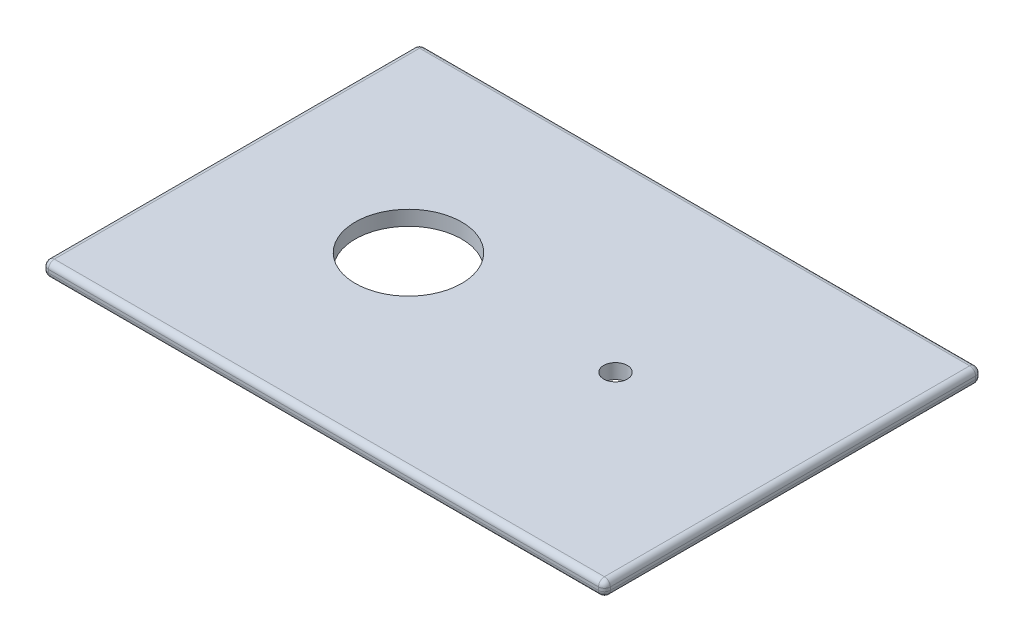
ISO-10303-21;
HEADER;
FILE_DESCRIPTION(('STEP AP214'),'2;1');
FILE_NAME('part.step','',(''),(''),'','','');
FILE_SCHEMA(('AUTOMOTIVE_DESIGN { 1 0 10303 214 1 1 1 1 }'));
ENDSEC;
DATA;
#1=APPLICATION_CONTEXT('core data for automotive mechanical design processes');
#2=APPLICATION_PROTOCOL_DEFINITION('international standard','automotive_design',2000,#1);
#3=PRODUCT_CONTEXT('',#1,'mechanical');
#4=PRODUCT('Part','Part','',(#3));
#5=PRODUCT_RELATED_PRODUCT_CATEGORY('part','',(#4));
#6=PRODUCT_DEFINITION_FORMATION('','',#4);
#7=PRODUCT_DEFINITION_CONTEXT('part definition',#1,'design');
#8=PRODUCT_DEFINITION('design','',#6,#7);
#9=PRODUCT_DEFINITION_SHAPE('','',#8);
#10=(LENGTH_UNIT() NAMED_UNIT(*) SI_UNIT(.MILLI.,.METRE.));
#11=(NAMED_UNIT(*) PLANE_ANGLE_UNIT() SI_UNIT($,.RADIAN.));
#12=(NAMED_UNIT(*) SI_UNIT($,.STERADIAN.) SOLID_ANGLE_UNIT());
#13=UNCERTAINTY_MEASURE_WITH_UNIT(LENGTH_MEASURE(1.E-05),#10,'distance_accuracy_value','');
#14=(GEOMETRIC_REPRESENTATION_CONTEXT(3) GLOBAL_UNCERTAINTY_ASSIGNED_CONTEXT((#13)) GLOBAL_UNIT_ASSIGNED_CONTEXT((#10,
#11,#12)) REPRESENTATION_CONTEXT('',''));
#15=CARTESIAN_POINT('',(0.,0.,0.));
#16=DIRECTION('',(0.,0.,1.));
#17=DIRECTION('',(1.,0.,0.));
#18=AXIS2_PLACEMENT_3D('',#15,#16,#17);
#19=CARTESIAN_POINT('',(37.2,-7.1102724962,69.7));
#20=DIRECTION('',(0.,-1.,0.));
#21=DIRECTION('',(1.,0.,0.));
#22=AXIS2_PLACEMENT_3D('',#19,#20,#21);
#23=SPHERICAL_SURFACE('',#22,0.8);
#24=CARTESIAN_POINT('',(37.2,-7.1102724962,69.7));
#25=DIRECTION('',(0.,0.,-1.));
#26=DIRECTION('',(1.,0.,0.));
#27=AXIS2_PLACEMENT_3D('',#24,#25,#26);
#28=CIRCLE('',#27,0.8);
#29=CARTESIAN_POINT('',(37.2,-6.3102724962,69.7));
#30=VERTEX_POINT('',#29);
#31=CARTESIAN_POINT('',(38.,-7.1102724962,69.7));
#32=VERTEX_POINT('',#31);
#33=EDGE_CURVE('E10',#30,#32,#28,.T.);
#34=ORIENTED_EDGE('',*,*,#33,.F.);
#35=CARTESIAN_POINT('',(37.2,-7.1102724962,69.7));
#36=DIRECTION('',(1.,0.,0.));
#37=DIRECTION('',(0.,0.,1.));
#38=AXIS2_PLACEMENT_3D('',#35,#36,#37);
#39=CIRCLE('',#38,0.8);
#40=CARTESIAN_POINT('',(37.2,-7.1102724962,70.5));
#41=VERTEX_POINT('',#40);
#42=EDGE_CURVE('E267',#30,#41,#39,.T.);
#43=ORIENTED_EDGE('',*,*,#42,.T.);
#44=CARTESIAN_POINT('',(37.2,-7.1102724962,69.7));
#45=DIRECTION('',(0.,-1.,0.));
#46=DIRECTION('',(1.,0.,0.));
#47=AXIS2_PLACEMENT_3D('',#44,#45,#46);
#48=CIRCLE('',#47,0.8);
#49=EDGE_CURVE('E271',#32,#41,#48,.T.);
#50=ORIENTED_EDGE('',*,*,#49,.F.);
#51=EDGE_LOOP('',(#34,#43,#50));
#52=FACE_BOUND('',#51,.T.);
#53=ADVANCED_FACE('F16',(#52),#23,.T.);
#54=CARTESIAN_POINT('',(37.2,-7.1102724962,20.3));
#55=DIRECTION('',(0.,0.,1.));
#56=DIRECTION('',(1.,0.,0.));
#57=AXIS2_PLACEMENT_3D('',#54,#55,#56);
#58=SPHERICAL_SURFACE('',#57,0.8);
#59=CARTESIAN_POINT('',(37.2,-7.1102724962,20.3));
#60=DIRECTION('',(0.,-1.,0.));
#61=DIRECTION('',(1.,0.,0.));
#62=AXIS2_PLACEMENT_3D('',#59,#60,#61);
#63=CIRCLE('',#62,0.8);
#64=CARTESIAN_POINT('',(37.2,-7.1102724962,19.5));
#65=VERTEX_POINT('',#64);
#66=CARTESIAN_POINT('',(38.,-7.1102724962,20.3));
#67=VERTEX_POINT('',#66);
#68=EDGE_CURVE('E257',#65,#67,#63,.T.);
#69=ORIENTED_EDGE('',*,*,#68,.F.);
#70=CARTESIAN_POINT('',(37.2,-7.1102724962,20.3));
#71=DIRECTION('',(1.,0.,0.));
#72=DIRECTION('',(0.,1.,0.));
#73=AXIS2_PLACEMENT_3D('',#70,#71,#72);
#74=CIRCLE('',#73,0.8);
#75=CARTESIAN_POINT('',(37.2,-6.3102724962,20.3));
#76=VERTEX_POINT('',#75);
#77=EDGE_CURVE('E252',#65,#76,#74,.T.);
#78=ORIENTED_EDGE('',*,*,#77,.T.);
#79=CARTESIAN_POINT('',(37.2,-7.1102724962,20.3));
#80=DIRECTION('',(0.,0.,1.));
#81=DIRECTION('',(1.,0.,0.));
#82=AXIS2_PLACEMENT_3D('',#79,#80,#81);
#83=CIRCLE('',#82,0.8);
#84=EDGE_CURVE('E25',#67,#76,#83,.T.);
#85=ORIENTED_EDGE('',*,*,#84,.F.);
#86=EDGE_LOOP('',(#69,#78,#85));
#87=FACE_BOUND('',#86,.T.);
#88=ADVANCED_FACE('F352',(#87),#58,.T.);
#89=CARTESIAN_POINT('',(38.,-8.3102724962,19.5));
#90=DIRECTION('',(1.,0.,0.));
#91=DIRECTION('',(0.,1.,0.));
#92=AXIS2_PLACEMENT_3D('',#89,#90,#91);
#93=PLANE('',#92);
#94=DIRECTION('',(0.,0.,1.));
#95=VECTOR('',#94,1.);
#96=CARTESIAN_POINT('',(38.,-7.5102724962,19.5));
#97=LINE('',#96,#95);
#98=CARTESIAN_POINT('',(38.,-7.5102724962,20.3));
#99=VERTEX_POINT('',#98);
#100=CARTESIAN_POINT('',(38.,-7.5102724962,69.7));
#101=VERTEX_POINT('',#100);
#102=EDGE_CURVE('E216',#99,#101,#97,.T.);
#103=ORIENTED_EDGE('',*,*,#102,.F.);
#104=DIRECTION('',(0.,1.,0.));
#105=VECTOR('',#104,1.);
#106=CARTESIAN_POINT('',(38.,-8.3102724962,20.3));
#107=LINE('',#106,#105);
#108=EDGE_CURVE('E263',#99,#67,#107,.T.);
#109=ORIENTED_EDGE('',*,*,#108,.T.);
#110=DIRECTION('',(0.,0.,1.));
#111=VECTOR('',#110,1.);
#112=CARTESIAN_POINT('',(38.,-7.1102724962,19.5));
#113=LINE('',#112,#111);
#114=EDGE_CURVE('E19',#67,#32,#113,.T.);
#115=ORIENTED_EDGE('',*,*,#114,.T.);
#116=DIRECTION('',(0.,1.,0.));
#117=VECTOR('',#116,1.);
#118=CARTESIAN_POINT('',(38.,-8.3102724962,69.7));
#119=LINE('',#118,#117);
#120=EDGE_CURVE('E268',#101,#32,#119,.T.);
#121=ORIENTED_EDGE('',*,*,#120,.F.);
#122=EDGE_LOOP('',(#103,#109,#115,#121));
#123=FACE_BOUND('',#122,.T.);
#124=ADVANCED_FACE('F760',(#123),#93,.T.);
#125=CARTESIAN_POINT('',(37.2,-7.5102724962,69.7));
#126=DIRECTION('',(0.,0.,-1.));
#127=DIRECTION('',(1.,0.,0.));
#128=AXIS2_PLACEMENT_3D('',#125,#126,#127);
#129=SPHERICAL_SURFACE('',#128,0.8);
#130=CARTESIAN_POINT('',(37.2,-7.5102724962,69.7));
#131=DIRECTION('',(0.,1.,0.));
#132=DIRECTION('',(1.,0.,0.));
#133=AXIS2_PLACEMENT_3D('',#130,#131,#132);
#134=CIRCLE('',#133,0.8);
#135=CARTESIAN_POINT('',(37.2,-7.5102724962,70.5));
#136=VERTEX_POINT('',#135);
#137=EDGE_CURVE('E273',#136,#101,#134,.T.);
#138=ORIENTED_EDGE('',*,*,#137,.F.);
#139=CARTESIAN_POINT('',(37.2,-7.5102724962,69.7));
#140=DIRECTION('',(1.,0.,0.));
#141=DIRECTION('',(0.,-1.,0.));
#142=AXIS2_PLACEMENT_3D('',#139,#140,#141);
#143=CIRCLE('',#142,0.8);
#144=CARTESIAN_POINT('',(37.2,-8.3102724962,69.7));
#145=VERTEX_POINT('',#144);
#146=EDGE_CURVE('E248',#136,#145,#143,.T.);
#147=ORIENTED_EDGE('',*,*,#146,.T.);
#148=CARTESIAN_POINT('',(37.2,-7.5102724962,69.7));
#149=DIRECTION('',(0.,0.,-1.));
#150=DIRECTION('',(1.,0.,0.));
#151=AXIS2_PLACEMENT_3D('',#148,#149,#150);
#152=CIRCLE('',#151,0.8);
#153=EDGE_CURVE('E217',#101,#145,#152,.T.);
#154=ORIENTED_EDGE('',*,*,#153,.F.);
#155=EDGE_LOOP('',(#138,#147,#154));
#156=FACE_BOUND('',#155,.T.);
#157=ADVANCED_FACE('F543',(#156),#129,.T.);
#158=CARTESIAN_POINT('',(37.2,-7.5102724962,20.3));
#159=DIRECTION('',(0.,0.,1.));
#160=DIRECTION('',(1.,0.,0.));
#161=AXIS2_PLACEMENT_3D('',#158,#159,#160);
#162=SPHERICAL_SURFACE('',#161,0.8);
#163=CARTESIAN_POINT('',(37.2,-7.5102724962,20.3));
#164=DIRECTION('',(0.,0.,-1.));
#165=DIRECTION('',(1.,0.,0.));
#166=AXIS2_PLACEMENT_3D('',#163,#164,#165);
#167=CIRCLE('',#166,0.8);
#168=CARTESIAN_POINT('',(37.2,-8.3102724962,20.3));
#169=VERTEX_POINT('',#168);
#170=EDGE_CURVE('E213',#99,#169,#167,.T.);
#171=ORIENTED_EDGE('',*,*,#170,.T.);
#172=CARTESIAN_POINT('',(37.2,-7.5102724962,20.3));
#173=DIRECTION('',(-1.,0.,0.));
#174=DIRECTION('',(0.,-1.,0.));
#175=AXIS2_PLACEMENT_3D('',#172,#173,#174);
#176=CIRCLE('',#175,0.8);
#177=CARTESIAN_POINT('',(37.2,-7.5102724962,19.5));
#178=VERTEX_POINT('',#177);
#179=EDGE_CURVE('E244',#178,#169,#176,.T.);
#180=ORIENTED_EDGE('',*,*,#179,.F.);
#181=CARTESIAN_POINT('',(37.2,-7.5102724962,20.3));
#182=DIRECTION('',(0.,-1.,0.));
#183=DIRECTION('',(1.,0.,0.));
#184=AXIS2_PLACEMENT_3D('',#181,#182,#183);
#185=CIRCLE('',#184,0.8);
#186=EDGE_CURVE('E253',#178,#99,#185,.T.);
#187=ORIENTED_EDGE('',*,*,#186,.T.);
#188=EDGE_LOOP('',(#171,#180,#187));
#189=FACE_BOUND('',#188,.T.);
#190=ADVANCED_FACE('F538',(#189),#162,.T.);
#191=CARTESIAN_POINT('',(37.2,-7.1102724962,19.5));
#192=DIRECTION('',(0.,0.,1.));
#193=DIRECTION('',(1.,0.,0.));
#194=AXIS2_PLACEMENT_3D('',#191,#192,#193);
#195=CYLINDRICAL_SURFACE('',#194,0.8);
#196=ORIENTED_EDGE('',*,*,#114,.F.);
#197=ORIENTED_EDGE('',*,*,#84,.T.);
#198=DIRECTION('',(0.,0.,1.));
#199=VECTOR('',#198,1.);
#200=CARTESIAN_POINT('',(37.2,-6.3102724962,19.5));
#201=LINE('',#200,#199);
#202=EDGE_CURVE('E142',#76,#30,#201,.T.);
#203=ORIENTED_EDGE('',*,*,#202,.T.);
#204=ORIENTED_EDGE('',*,*,#33,.T.);
#205=EDGE_LOOP('',(#196,#197,#203,#204));
#206=FACE_BOUND('',#205,.T.);
#207=ADVANCED_FACE('F349',(#206),#195,.T.);
#208=CARTESIAN_POINT('',(37.2,-8.3102724962,69.7));
#209=DIRECTION('',(0.,1.,0.));
#210=DIRECTION('',(1.,0.,0.));
#211=AXIS2_PLACEMENT_3D('',#208,#209,#210);
#212=CYLINDRICAL_SURFACE('',#211,0.8);
#213=ORIENTED_EDGE('',*,*,#120,.T.);
#214=ORIENTED_EDGE('',*,*,#49,.T.);
#215=DIRECTION('',(0.,1.,0.));
#216=VECTOR('',#215,1.);
#217=CARTESIAN_POINT('',(37.2,-8.3102724962,70.5));
#218=LINE('',#217,#216);
#219=EDGE_CURVE('E224',#136,#41,#218,.T.);
#220=ORIENTED_EDGE('',*,*,#219,.F.);
#221=ORIENTED_EDGE('',*,*,#137,.T.);
#222=EDGE_LOOP('',(#213,#214,#220,#221));
#223=FACE_BOUND('',#222,.T.);
#224=ADVANCED_FACE('F734',(#223),#212,.T.);
#225=CARTESIAN_POINT('',(-38.,-7.1102724962,69.7));
#226=DIRECTION('',(1.,0.,0.));
#227=DIRECTION('',(0.,1.,0.));
#228=AXIS2_PLACEMENT_3D('',#225,#226,#227);
#229=CYLINDRICAL_SURFACE('',#228,0.8);
#230=CARTESIAN_POINT('',(-37.2,-7.1102724962,69.7));
#231=DIRECTION('',(1.,0.,0.));
#232=DIRECTION('',(0.,0.,1.));
#233=AXIS2_PLACEMENT_3D('',#230,#231,#232);
#234=CIRCLE('',#233,0.8);
#235=CARTESIAN_POINT('',(-37.2,-6.3102724962,69.7));
#236=VERTEX_POINT('',#235);
#237=CARTESIAN_POINT('',(-37.2,-7.1102724962,70.5));
#238=VERTEX_POINT('',#237);
#239=EDGE_CURVE('E232',#236,#238,#234,.T.);
#240=ORIENTED_EDGE('',*,*,#239,.T.);
#241=DIRECTION('',(1.,0.,0.));
#242=VECTOR('',#241,1.);
#243=CARTESIAN_POINT('',(-38.,-7.1102724962,70.5));
#244=LINE('',#243,#242);
#245=EDGE_CURVE('E228',#238,#41,#244,.T.);
#246=ORIENTED_EDGE('',*,*,#245,.T.);
#247=ORIENTED_EDGE('',*,*,#42,.F.);
#248=DIRECTION('',(1.,0.,0.));
#249=VECTOR('',#248,1.);
#250=CARTESIAN_POINT('',(-38.,-6.3102724962,69.7));
#251=LINE('',#250,#249);
#252=EDGE_CURVE('E202',#236,#30,#251,.T.);
#253=ORIENTED_EDGE('',*,*,#252,.F.);
#254=EDGE_LOOP('',(#240,#246,#247,#253));
#255=FACE_BOUND('',#254,.T.);
#256=ADVANCED_FACE('F347',(#255),#229,.T.);
#257=CARTESIAN_POINT('',(37.2,-8.3102724962,20.3));
#258=DIRECTION('',(0.,1.,0.));
#259=DIRECTION('',(1.,0.,0.));
#260=AXIS2_PLACEMENT_3D('',#257,#258,#259);
#261=CYLINDRICAL_SURFACE('',#260,0.8);
#262=ORIENTED_EDGE('',*,*,#186,.F.);
#263=DIRECTION('',(0.,1.,0.));
#264=VECTOR('',#263,1.);
#265=CARTESIAN_POINT('',(37.2,-8.3102724962,19.5));
#266=LINE('',#265,#264);
#267=EDGE_CURVE('E207',#178,#65,#266,.T.);
#268=ORIENTED_EDGE('',*,*,#267,.T.);
#269=ORIENTED_EDGE('',*,*,#68,.T.);
#270=ORIENTED_EDGE('',*,*,#108,.F.);
#271=EDGE_LOOP('',(#262,#268,#269,#270));
#272=FACE_BOUND('',#271,.T.);
#273=ADVANCED_FACE('F355',(#272),#261,.T.);
#274=CARTESIAN_POINT('',(-38.,-7.1102724962,20.3));
#275=DIRECTION('',(1.,0.,0.));
#276=DIRECTION('',(0.,1.,0.));
#277=AXIS2_PLACEMENT_3D('',#274,#275,#276);
#278=CYLINDRICAL_SURFACE('',#277,0.8);
#279=DIRECTION('',(1.,0.,0.));
#280=VECTOR('',#279,1.);
#281=CARTESIAN_POINT('',(-38.,-6.3102724962,20.3));
#282=LINE('',#281,#280);
#283=CARTESIAN_POINT('',(-37.2,-6.3102724962,20.3));
#284=VERTEX_POINT('',#283);
#285=EDGE_CURVE('E135',#284,#76,#282,.T.);
#286=ORIENTED_EDGE('',*,*,#285,.T.);
#287=ORIENTED_EDGE('',*,*,#77,.F.);
#288=DIRECTION('',(1.,0.,0.));
#289=VECTOR('',#288,1.);
#290=CARTESIAN_POINT('',(-38.,-7.1102724962,19.5));
#291=LINE('',#290,#289);
#292=CARTESIAN_POINT('',(-37.2,-7.1102724962,19.5));
#293=VERTEX_POINT('',#292);
#294=EDGE_CURVE('E153',#293,#65,#291,.T.);
#295=ORIENTED_EDGE('',*,*,#294,.F.);
#296=CARTESIAN_POINT('',(-37.2,-7.1102724962,20.3));
#297=DIRECTION('',(1.,0.,0.));
#298=DIRECTION('',(0.,1.,0.));
#299=AXIS2_PLACEMENT_3D('',#296,#297,#298);
#300=CIRCLE('',#299,0.8);
#301=EDGE_CURVE('E149',#293,#284,#300,.T.);
#302=ORIENTED_EDGE('',*,*,#301,.T.);
#303=EDGE_LOOP('',(#286,#287,#295,#302));
#304=FACE_BOUND('',#303,.T.);
#305=ADVANCED_FACE('F151',(#304),#278,.T.);
#306=CARTESIAN_POINT('',(14.,-5.0102724962,45.));
#307=DIRECTION('',(0.,-1.,0.));
#308=DIRECTION('',(1.,0.,0.));
#309=AXIS2_PLACEMENT_3D('',#306,#307,#308);
#310=CYLINDRICAL_SURFACE('',#309,1.6);
#311=CARTESIAN_POINT('',(14.,-8.3102724962,45.));
#312=DIRECTION('',(0.,-1.,0.));
#313=DIRECTION('',(1.,0.,0.));
#314=AXIS2_PLACEMENT_3D('',#311,#312,#313);
#315=CIRCLE('',#314,1.6);
#316=CARTESIAN_POINT('',(15.6,-8.3102724962,45.));
#317=VERTEX_POINT('',#316);
#318=EDGE_CURVE('E203',#317,#317,#315,.T.);
#319=ORIENTED_EDGE('',*,*,#318,.T.);
#320=EDGE_LOOP('',(#319));
#321=FACE_BOUND('',#320,.T.);
#322=CARTESIAN_POINT('',(14.,-6.3102724962,45.));
#323=DIRECTION('',(0.,-1.,0.));
#324=DIRECTION('',(1.,0.,0.));
#325=AXIS2_PLACEMENT_3D('',#322,#323,#324);
#326=CIRCLE('',#325,1.6);
#327=CARTESIAN_POINT('',(15.6,-6.3102724962,45.));
#328=VERTEX_POINT('',#327);
#329=EDGE_CURVE('E240',#328,#328,#326,.T.);
#330=ORIENTED_EDGE('',*,*,#329,.F.);
#331=EDGE_LOOP('',(#330));
#332=FACE_BOUND('',#331,.T.);
#333=ADVANCED_FACE('F654',(#321,#332),#310,.F.);
#334=CARTESIAN_POINT('',(-14.,-5.0102724962,45.));
#335=DIRECTION('',(0.,-1.,0.));
#336=DIRECTION('',(1.,0.,0.));
#337=AXIS2_PLACEMENT_3D('',#334,#335,#336);
#338=CYLINDRICAL_SURFACE('',#337,7.2);
#339=CARTESIAN_POINT('',(-14.,-8.3102724962,45.));
#340=DIRECTION('',(0.,-1.,0.));
#341=DIRECTION('',(1.,0.,0.));
#342=AXIS2_PLACEMENT_3D('',#339,#340,#341);
#343=CIRCLE('',#342,7.2);
#344=CARTESIAN_POINT('',(-6.8,-8.3102724962,45.));
#345=VERTEX_POINT('',#344);
#346=EDGE_CURVE('E199',#345,#345,#343,.T.);
#347=ORIENTED_EDGE('',*,*,#346,.T.);
#348=EDGE_LOOP('',(#347));
#349=FACE_BOUND('',#348,.T.);
#350=CARTESIAN_POINT('',(-14.,-6.3102724962,45.));
#351=DIRECTION('',(0.,-1.,0.));
#352=DIRECTION('',(1.,0.,0.));
#353=AXIS2_PLACEMENT_3D('',#350,#351,#352);
#354=CIRCLE('',#353,7.2);
#355=CARTESIAN_POINT('',(-6.8,-6.3102724962,45.));
#356=VERTEX_POINT('',#355);
#357=EDGE_CURVE('E146',#356,#356,#354,.T.);
#358=ORIENTED_EDGE('',*,*,#357,.F.);
#359=EDGE_LOOP('',(#358));
#360=FACE_BOUND('',#359,.T.);
#361=ADVANCED_FACE('F648',(#349,#360),#338,.F.);
#362=CARTESIAN_POINT('',(37.2,-7.5102724962,19.5));
#363=DIRECTION('',(0.,0.,1.));
#364=DIRECTION('',(1.,0.,0.));
#365=AXIS2_PLACEMENT_3D('',#362,#363,#364);
#366=CYLINDRICAL_SURFACE('',#365,0.8);
#367=ORIENTED_EDGE('',*,*,#153,.T.);
#368=DIRECTION('',(0.,0.,1.));
#369=VECTOR('',#368,1.);
#370=CARTESIAN_POINT('',(37.2,-8.3102724962,19.5));
#371=LINE('',#370,#369);
#372=EDGE_CURVE('E191',#169,#145,#371,.T.);
#373=ORIENTED_EDGE('',*,*,#372,.F.);
#374=ORIENTED_EDGE('',*,*,#170,.F.);
#375=ORIENTED_EDGE('',*,*,#102,.T.);
#376=EDGE_LOOP('',(#367,#373,#374,#375));
#377=FACE_BOUND('',#376,.T.);
#378=ADVANCED_FACE('F653',(#377),#366,.T.);
#379=CARTESIAN_POINT('',(-38.,-7.5102724962,69.7));
#380=DIRECTION('',(1.,0.,0.));
#381=DIRECTION('',(0.,-1.,0.));
#382=AXIS2_PLACEMENT_3D('',#379,#380,#381);
#383=CYLINDRICAL_SURFACE('',#382,0.8);
#384=DIRECTION('',(1.,0.,0.));
#385=VECTOR('',#384,1.);
#386=CARTESIAN_POINT('',(-38.,-8.3102724962,69.7));
#387=LINE('',#386,#385);
#388=CARTESIAN_POINT('',(-37.2,-8.3102724962,69.7));
#389=VERTEX_POINT('',#388);
#390=EDGE_CURVE('E195',#389,#145,#387,.T.);
#391=ORIENTED_EDGE('',*,*,#390,.T.);
#392=ORIENTED_EDGE('',*,*,#146,.F.);
#393=DIRECTION('',(1.,0.,0.));
#394=VECTOR('',#393,1.);
#395=CARTESIAN_POINT('',(-38.,-7.5102724962,70.5));
#396=LINE('',#395,#394);
#397=CARTESIAN_POINT('',(-37.2,-7.5102724962,70.5));
#398=VERTEX_POINT('',#397);
#399=EDGE_CURVE('E158',#398,#136,#396,.T.);
#400=ORIENTED_EDGE('',*,*,#399,.F.);
#401=CARTESIAN_POINT('',(-37.2,-7.5102724962,69.7));
#402=DIRECTION('',(1.,0.,0.));
#403=DIRECTION('',(0.,-1.,0.));
#404=AXIS2_PLACEMENT_3D('',#401,#402,#403);
#405=CIRCLE('',#404,0.8);
#406=EDGE_CURVE('E183',#398,#389,#405,.T.);
#407=ORIENTED_EDGE('',*,*,#406,.T.);
#408=EDGE_LOOP('',(#391,#392,#400,#407));
#409=FACE_BOUND('',#408,.T.);
#410=ADVANCED_FACE('F677',(#409),#383,.T.);
#411=CARTESIAN_POINT('',(-38.,-7.5102724962,20.3));
#412=DIRECTION('',(1.,0.,0.));
#413=DIRECTION('',(0.,-1.,0.));
#414=AXIS2_PLACEMENT_3D('',#411,#412,#413);
#415=CYLINDRICAL_SURFACE('',#414,0.8);
#416=CARTESIAN_POINT('',(-37.2,-7.5102724962,20.3));
#417=DIRECTION('',(-1.,0.,0.));
#418=DIRECTION('',(0.,-1.,0.));
#419=AXIS2_PLACEMENT_3D('',#416,#417,#418);
#420=CIRCLE('',#419,0.8);
#421=CARTESIAN_POINT('',(-37.2,-7.5102724962,19.5));
#422=VERTEX_POINT('',#421);
#423=CARTESIAN_POINT('',(-37.2,-8.3102724962,20.3));
#424=VERTEX_POINT('',#423);
#425=EDGE_CURVE('E169',#422,#424,#420,.T.);
#426=ORIENTED_EDGE('',*,*,#425,.F.);
#427=DIRECTION('',(1.,0.,0.));
#428=VECTOR('',#427,1.);
#429=CARTESIAN_POINT('',(-38.,-7.5102724962,19.5));
#430=LINE('',#429,#428);
#431=EDGE_CURVE('E159',#422,#178,#430,.T.);
#432=ORIENTED_EDGE('',*,*,#431,.T.);
#433=ORIENTED_EDGE('',*,*,#179,.T.);
#434=DIRECTION('',(1.,0.,0.));
#435=VECTOR('',#434,1.);
#436=CARTESIAN_POINT('',(-38.,-8.3102724962,20.3));
#437=LINE('',#436,#435);
#438=EDGE_CURVE('E187',#424,#169,#437,.T.);
#439=ORIENTED_EDGE('',*,*,#438,.F.);
#440=EDGE_LOOP('',(#426,#432,#433,#439));
#441=FACE_BOUND('',#440,.T.);
#442=ADVANCED_FACE('F666',(#441),#415,.T.);
#443=CARTESIAN_POINT('',(-38.,-6.3102724962,19.5));
#444=DIRECTION('',(0.,1.,0.));
#445=DIRECTION('',(1.,0.,0.));
#446=AXIS2_PLACEMENT_3D('',#443,#444,#445);
#447=PLANE('',#446);
#448=ORIENTED_EDGE('',*,*,#329,.T.);
#449=EDGE_LOOP('',(#448));
#450=FACE_BOUND('',#449,.T.);
#451=ORIENTED_EDGE('',*,*,#357,.T.);
#452=EDGE_LOOP('',(#451));
#453=FACE_BOUND('',#452,.T.);
#454=DIRECTION('',(0.,0.,1.));
#455=VECTOR('',#454,1.);
#456=CARTESIAN_POINT('',(-37.2,-6.3102724962,19.5));
#457=LINE('',#456,#455);
#458=EDGE_CURVE('E140',#284,#236,#457,.T.);
#459=ORIENTED_EDGE('',*,*,#458,.T.);
#460=ORIENTED_EDGE('',*,*,#252,.T.);
#461=ORIENTED_EDGE('',*,*,#202,.F.);
#462=ORIENTED_EDGE('',*,*,#285,.F.);
#463=EDGE_LOOP('',(#459,#460,#461,#462));
#464=FACE_BOUND('',#463,.T.);
#465=ADVANCED_FACE('F137',(#450,#453,#464),#447,.T.);
#466=CARTESIAN_POINT('',(-37.2,-7.1102724962,69.7));
#467=DIRECTION('',(0.,-1.,0.));
#468=DIRECTION('',(-1.,0.,0.));
#469=AXIS2_PLACEMENT_3D('',#466,#467,#468);
#470=SPHERICAL_SURFACE('',#469,0.8);
#471=CARTESIAN_POINT('',(-37.2,-7.1102724962,69.7));
#472=DIRECTION('',(0.,1.,0.));
#473=DIRECTION('',(-1.,0.,0.));
#474=AXIS2_PLACEMENT_3D('',#471,#472,#473);
#475=CIRCLE('',#474,0.8);
#476=CARTESIAN_POINT('',(-38.,-7.1102724962,69.7));
#477=VERTEX_POINT('',#476);
#478=EDGE_CURVE('E179',#477,#238,#475,.T.);
#479=ORIENTED_EDGE('',*,*,#478,.T.);
#480=ORIENTED_EDGE('',*,*,#239,.F.);
#481=CARTESIAN_POINT('',(-37.2,-7.1102724962,69.7));
#482=DIRECTION('',(0.,0.,1.));
#483=DIRECTION('',(-1.,0.,0.));
#484=AXIS2_PLACEMENT_3D('',#481,#482,#483);
#485=CIRCLE('',#484,0.8);
#486=EDGE_CURVE('E172',#236,#477,#485,.T.);
#487=ORIENTED_EDGE('',*,*,#486,.T.);
#488=EDGE_LOOP('',(#479,#480,#487));
#489=FACE_BOUND('',#488,.T.);
#490=ADVANCED_FACE('F346',(#489),#470,.T.);
#491=CARTESIAN_POINT('',(-38.,-8.3102724962,70.5));
#492=DIRECTION('',(0.,0.,1.));
#493=DIRECTION('',(1.,0.,0.));
#494=AXIS2_PLACEMENT_3D('',#491,#492,#493);
#495=PLANE('',#494);
#496=DIRECTION('',(0.,1.,0.));
#497=VECTOR('',#496,1.);
#498=CARTESIAN_POINT('',(-37.2,-8.3102724962,70.5));
#499=LINE('',#498,#497);
#500=EDGE_CURVE('E320',#398,#238,#499,.T.);
#501=ORIENTED_EDGE('',*,*,#500,.F.);
#502=ORIENTED_EDGE('',*,*,#399,.T.);
#503=ORIENTED_EDGE('',*,*,#219,.T.);
#504=ORIENTED_EDGE('',*,*,#245,.F.);
#505=EDGE_LOOP('',(#501,#502,#503,#504));
#506=FACE_BOUND('',#505,.T.);
#507=ADVANCED_FACE('F341',(#506),#495,.T.);
#508=CARTESIAN_POINT('',(-37.2,-7.1102724962,20.3));
#509=DIRECTION('',(0.,0.,1.));
#510=DIRECTION('',(-1.,0.,0.));
#511=AXIS2_PLACEMENT_3D('',#508,#509,#510);
#512=SPHERICAL_SURFACE('',#511,0.8);
#513=CARTESIAN_POINT('',(-37.2,-7.1102724962,20.3));
#514=DIRECTION('',(0.,0.,-1.));
#515=DIRECTION('',(-1.,0.,0.));
#516=AXIS2_PLACEMENT_3D('',#513,#514,#515);
#517=CIRCLE('',#516,0.8);
#518=CARTESIAN_POINT('',(-38.,-7.1102724962,20.3));
#519=VERTEX_POINT('',#518);
#520=EDGE_CURVE('E161',#519,#284,#517,.T.);
#521=ORIENTED_EDGE('',*,*,#520,.T.);
#522=ORIENTED_EDGE('',*,*,#301,.F.);
#523=CARTESIAN_POINT('',(-37.2,-7.1102724962,20.3));
#524=DIRECTION('',(0.,1.,0.));
#525=DIRECTION('',(-1.,0.,0.));
#526=AXIS2_PLACEMENT_3D('',#523,#524,#525);
#527=CIRCLE('',#526,0.8);
#528=EDGE_CURVE('E164',#293,#519,#527,.T.);
#529=ORIENTED_EDGE('',*,*,#528,.T.);
#530=EDGE_LOOP('',(#521,#522,#529));
#531=FACE_BOUND('',#530,.T.);
#532=ADVANCED_FACE('F162',(#531),#512,.T.);
#533=CARTESIAN_POINT('',(-38.,-8.3102724962,19.5));
#534=DIRECTION('',(0.,0.,1.));
#535=DIRECTION('',(1.,0.,0.));
#536=AXIS2_PLACEMENT_3D('',#533,#534,#535);
#537=PLANE('',#536);
#538=ORIENTED_EDGE('',*,*,#294,.T.);
#539=ORIENTED_EDGE('',*,*,#267,.F.);
#540=ORIENTED_EDGE('',*,*,#431,.F.);
#541=DIRECTION('',(0.,1.,0.));
#542=VECTOR('',#541,1.);
#543=CARTESIAN_POINT('',(-37.2,-8.3102724962,19.5));
#544=LINE('',#543,#542);
#545=EDGE_CURVE('E316',#422,#293,#544,.T.);
#546=ORIENTED_EDGE('',*,*,#545,.T.);
#547=EDGE_LOOP('',(#538,#539,#540,#546));
#548=FACE_BOUND('',#547,.T.);
#549=ADVANCED_FACE('F358',(#548),#537,.F.);
#550=CARTESIAN_POINT('',(-38.,-8.3102724962,19.5));
#551=DIRECTION('',(0.,1.,0.));
#552=DIRECTION('',(1.,0.,0.));
#553=AXIS2_PLACEMENT_3D('',#550,#551,#552);
#554=PLANE('',#553);
#555=ORIENTED_EDGE('',*,*,#318,.F.);
#556=EDGE_LOOP('',(#555));
#557=FACE_BOUND('',#556,.T.);
#558=ORIENTED_EDGE('',*,*,#346,.F.);
#559=EDGE_LOOP('',(#558));
#560=FACE_BOUND('',#559,.T.);
#561=ORIENTED_EDGE('',*,*,#438,.T.);
#562=ORIENTED_EDGE('',*,*,#372,.T.);
#563=ORIENTED_EDGE('',*,*,#390,.F.);
#564=DIRECTION('',(0.,0.,1.));
#565=VECTOR('',#564,1.);
#566=CARTESIAN_POINT('',(-37.2,-8.3102724962,19.5));
#567=LINE('',#566,#565);
#568=EDGE_CURVE('E304',#424,#389,#567,.T.);
#569=ORIENTED_EDGE('',*,*,#568,.F.);
#570=EDGE_LOOP('',(#561,#562,#563,#569));
#571=FACE_BOUND('',#570,.T.);
#572=ADVANCED_FACE('F605',(#557,#560,#571),#554,.F.);
#573=CARTESIAN_POINT('',(-37.2,-7.5102724962,69.7));
#574=DIRECTION('',(0.,0.,-1.));
#575=DIRECTION('',(-1.,0.,0.));
#576=AXIS2_PLACEMENT_3D('',#573,#574,#575);
#577=SPHERICAL_SURFACE('',#576,0.8);
#578=CARTESIAN_POINT('',(-37.2,-7.5102724962,69.7));
#579=DIRECTION('',(0.,0.,1.));
#580=DIRECTION('',(-1.,0.,0.));
#581=AXIS2_PLACEMENT_3D('',#578,#579,#580);
#582=CIRCLE('',#581,0.8);
#583=CARTESIAN_POINT('',(-38.,-7.5102724962,69.7));
#584=VERTEX_POINT('',#583);
#585=EDGE_CURVE('E308',#584,#389,#582,.T.);
#586=ORIENTED_EDGE('',*,*,#585,.T.);
#587=ORIENTED_EDGE('',*,*,#406,.F.);
#588=CARTESIAN_POINT('',(-37.2,-7.5102724962,69.7));
#589=DIRECTION('',(0.,-1.,0.));
#590=DIRECTION('',(-1.,0.,0.));
#591=AXIS2_PLACEMENT_3D('',#588,#589,#590);
#592=CIRCLE('',#591,0.8);
#593=EDGE_CURVE('E327',#398,#584,#592,.T.);
#594=ORIENTED_EDGE('',*,*,#593,.T.);
#595=EDGE_LOOP('',(#586,#587,#594));
#596=FACE_BOUND('',#595,.T.);
#597=ADVANCED_FACE('F594',(#596),#577,.T.);
#598=CARTESIAN_POINT('',(-37.2,-7.5102724962,20.3));
#599=DIRECTION('',(0.,0.,1.));
#600=DIRECTION('',(-1.,0.,0.));
#601=AXIS2_PLACEMENT_3D('',#598,#599,#600);
#602=SPHERICAL_SURFACE('',#601,0.8);
#603=CARTESIAN_POINT('',(-37.2,-7.5102724962,20.3));
#604=DIRECTION('',(0.,1.,0.));
#605=DIRECTION('',(-1.,0.,0.));
#606=AXIS2_PLACEMENT_3D('',#603,#604,#605);
#607=CIRCLE('',#606,0.8);
#608=CARTESIAN_POINT('',(-38.,-7.5102724962,20.3));
#609=VERTEX_POINT('',#608);
#610=EDGE_CURVE('E326',#422,#609,#607,.T.);
#611=ORIENTED_EDGE('',*,*,#610,.F.);
#612=ORIENTED_EDGE('',*,*,#425,.T.);
#613=CARTESIAN_POINT('',(-37.2,-7.5102724962,20.3));
#614=DIRECTION('',(0.,0.,1.));
#615=DIRECTION('',(-1.,0.,0.));
#616=AXIS2_PLACEMENT_3D('',#613,#614,#615);
#617=CIRCLE('',#616,0.8);
#618=EDGE_CURVE('E300',#609,#424,#617,.T.);
#619=ORIENTED_EDGE('',*,*,#618,.F.);
#620=EDGE_LOOP('',(#611,#612,#619));
#621=FACE_BOUND('',#620,.T.);
#622=ADVANCED_FACE('F584',(#621),#602,.T.);
#623=CARTESIAN_POINT('',(-37.2,-7.1102724962,19.5));
#624=DIRECTION('',(0.,0.,1.));
#625=DIRECTION('',(-1.,0.,0.));
#626=AXIS2_PLACEMENT_3D('',#623,#624,#625);
#627=CYLINDRICAL_SURFACE('',#626,0.8);
#628=ORIENTED_EDGE('',*,*,#486,.F.);
#629=ORIENTED_EDGE('',*,*,#458,.F.);
#630=ORIENTED_EDGE('',*,*,#520,.F.);
#631=DIRECTION('',(0.,0.,1.));
#632=VECTOR('',#631,1.);
#633=CARTESIAN_POINT('',(-38.,-7.1102724962,19.5));
#634=LINE('',#633,#632);
#635=EDGE_CURVE('E293',#519,#477,#634,.T.);
#636=ORIENTED_EDGE('',*,*,#635,.T.);
#637=EDGE_LOOP('',(#628,#629,#630,#636));
#638=FACE_BOUND('',#637,.T.);
#639=ADVANCED_FACE('F171',(#638),#627,.T.);
#640=CARTESIAN_POINT('',(-37.2,-8.3102724962,69.7));
#641=DIRECTION('',(0.,1.,0.));
#642=DIRECTION('',(-1.,0.,0.));
#643=AXIS2_PLACEMENT_3D('',#640,#641,#642);
#644=CYLINDRICAL_SURFACE('',#643,0.8);
#645=ORIENTED_EDGE('',*,*,#593,.F.);
#646=ORIENTED_EDGE('',*,*,#500,.T.);
#647=ORIENTED_EDGE('',*,*,#478,.F.);
#648=DIRECTION('',(0.,1.,0.));
#649=VECTOR('',#648,1.);
#650=CARTESIAN_POINT('',(-38.,-8.3102724962,69.7));
#651=LINE('',#650,#649);
#652=EDGE_CURVE('E288',#584,#477,#651,.T.);
#653=ORIENTED_EDGE('',*,*,#652,.F.);
#654=EDGE_LOOP('',(#645,#646,#647,#653));
#655=FACE_BOUND('',#654,.T.);
#656=ADVANCED_FACE('F337',(#655),#644,.T.);
#657=CARTESIAN_POINT('',(-37.2,-8.3102724962,20.3));
#658=DIRECTION('',(0.,1.,0.));
#659=DIRECTION('',(-1.,0.,0.));
#660=AXIS2_PLACEMENT_3D('',#657,#658,#659);
#661=CYLINDRICAL_SURFACE('',#660,0.8);
#662=DIRECTION('',(0.,1.,0.));
#663=VECTOR('',#662,1.);
#664=CARTESIAN_POINT('',(-38.,-8.3102724962,20.3));
#665=LINE('',#664,#663);
#666=EDGE_CURVE('E296',#609,#519,#665,.T.);
#667=ORIENTED_EDGE('',*,*,#666,.T.);
#668=ORIENTED_EDGE('',*,*,#528,.F.);
#669=ORIENTED_EDGE('',*,*,#545,.F.);
#670=ORIENTED_EDGE('',*,*,#610,.T.);
#671=EDGE_LOOP('',(#667,#668,#669,#670));
#672=FACE_BOUND('',#671,.T.);
#673=ADVANCED_FACE('F362',(#672),#661,.T.);
#674=CARTESIAN_POINT('',(-37.2,-7.5102724962,19.5));
#675=DIRECTION('',(0.,0.,1.));
#676=DIRECTION('',(-1.,0.,0.));
#677=AXIS2_PLACEMENT_3D('',#674,#675,#676);
#678=CYLINDRICAL_SURFACE('',#677,0.8);
#679=DIRECTION('',(0.,0.,1.));
#680=VECTOR('',#679,1.);
#681=CARTESIAN_POINT('',(-38.,-7.5102724962,19.5));
#682=LINE('',#681,#680);
#683=EDGE_CURVE('E299',#609,#584,#682,.T.);
#684=ORIENTED_EDGE('',*,*,#683,.F.);
#685=ORIENTED_EDGE('',*,*,#618,.T.);
#686=ORIENTED_EDGE('',*,*,#568,.T.);
#687=ORIENTED_EDGE('',*,*,#585,.F.);
#688=EDGE_LOOP('',(#684,#685,#686,#687));
#689=FACE_BOUND('',#688,.T.);
#690=ADVANCED_FACE('F520',(#689),#678,.T.);
#691=CARTESIAN_POINT('',(-38.,-8.3102724962,19.5));
#692=DIRECTION('',(1.,0.,0.));
#693=DIRECTION('',(0.,1.,0.));
#694=AXIS2_PLACEMENT_3D('',#691,#692,#693);
#695=PLANE('',#694);
#696=ORIENTED_EDGE('',*,*,#652,.T.);
#697=ORIENTED_EDGE('',*,*,#635,.F.);
#698=ORIENTED_EDGE('',*,*,#666,.F.);
#699=ORIENTED_EDGE('',*,*,#683,.T.);
#700=EDGE_LOOP('',(#696,#697,#698,#699));
#701=FACE_BOUND('',#700,.T.);
#702=ADVANCED_FACE('F370',(#701),#695,.F.);
#703=CLOSED_SHELL('',(#53,#88,#124,#157,#190,#207,#224,#256,#273,#305,#333,#361,#378,#410,#442,
#465,#490,#507,#532,#549,#572,#597,#622,#639,#656,#673,#690,#702));
#704=MANIFOLD_SOLID_BREP('B1',#703);
#705=ADVANCED_BREP_SHAPE_REPRESENTATION('',(#18,#704),#14);
#706=SHAPE_DEFINITION_REPRESENTATION(#9,#705);
ENDSEC;
END-ISO-10303-21;
